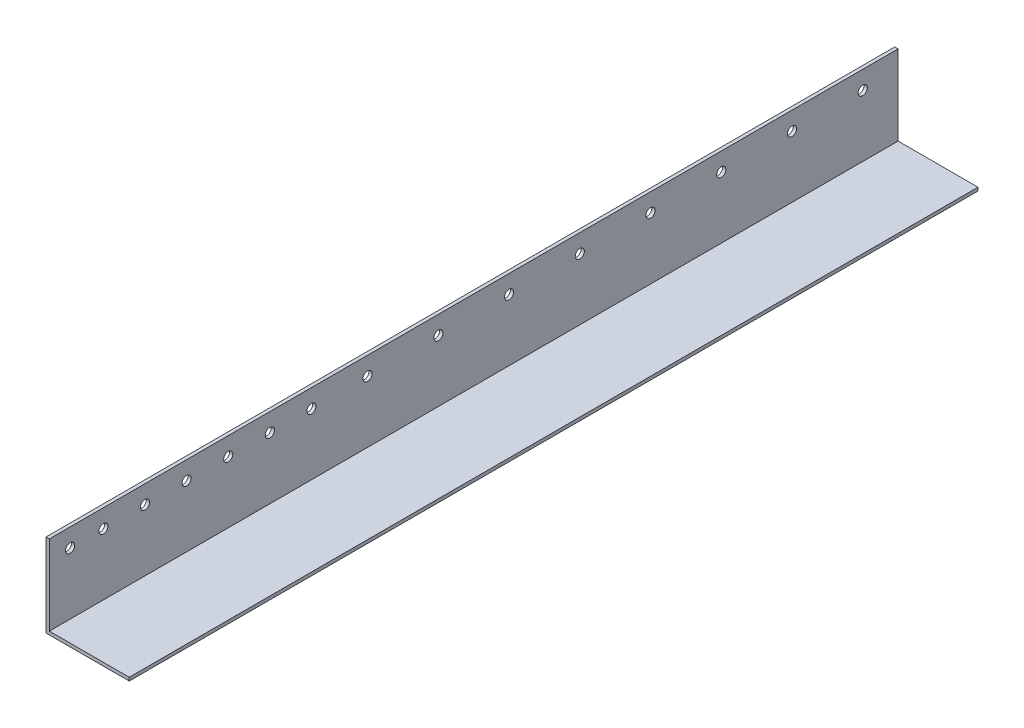
ISO-10303-21;
HEADER;
FILE_DESCRIPTION(('STEP AP214'),'2;1');
FILE_NAME('part.step','',(''),(''),'','','');
FILE_SCHEMA(('AUTOMOTIVE_DESIGN { 1 0 10303 214 1 1 1 1 }'));
ENDSEC;
DATA;
#1=APPLICATION_CONTEXT('core data for automotive mechanical design processes');
#2=APPLICATION_PROTOCOL_DEFINITION('international standard','automotive_design',2000,#1);
#3=PRODUCT_CONTEXT('',#1,'mechanical');
#4=PRODUCT('Part','Part','',(#3));
#5=PRODUCT_RELATED_PRODUCT_CATEGORY('part','',(#4));
#6=PRODUCT_DEFINITION_FORMATION('','',#4);
#7=PRODUCT_DEFINITION_CONTEXT('part definition',#1,'design');
#8=PRODUCT_DEFINITION('design','',#6,#7);
#9=PRODUCT_DEFINITION_SHAPE('','',#8);
#10=(LENGTH_UNIT() NAMED_UNIT(*) SI_UNIT(.MILLI.,.METRE.));
#11=(NAMED_UNIT(*) PLANE_ANGLE_UNIT() SI_UNIT($,.RADIAN.));
#12=(NAMED_UNIT(*) SI_UNIT($,.STERADIAN.) SOLID_ANGLE_UNIT());
#13=UNCERTAINTY_MEASURE_WITH_UNIT(LENGTH_MEASURE(1.E-05),#10,'distance_accuracy_value','');
#14=(GEOMETRIC_REPRESENTATION_CONTEXT(3) GLOBAL_UNCERTAINTY_ASSIGNED_CONTEXT((#13)) GLOBAL_UNIT_ASSIGNED_CONTEXT((#10,
#11,#12)) REPRESENTATION_CONTEXT('',''));
#15=CARTESIAN_POINT('',(0.,0.,0.));
#16=DIRECTION('',(0.,0.,1.));
#17=DIRECTION('',(1.,0.,0.));
#18=AXIS2_PLACEMENT_3D('',#15,#16,#17);
#19=CARTESIAN_POINT('',(0.,50.,510.));
#20=DIRECTION('',(1.,0.,0.));
#21=DIRECTION('',(0.,0.,-1.));
#22=AXIS2_PLACEMENT_3D('',#19,#20,#21);
#23=PLANE('',#22);
#24=CARTESIAN_POINT('',(0.,39.,21.25));
#25=DIRECTION('',(1.,0.,0.));
#26=DIRECTION('',(0.,0.,-1.));
#27=AXIS2_PLACEMENT_3D('',#24,#25,#26);
#28=CIRCLE('',#27,2.75);
#29=CARTESIAN_POINT('',(0.,39.,18.5));
#30=VERTEX_POINT('',#29);
#31=EDGE_CURVE('E127',#30,#30,#28,.T.);
#32=ORIENTED_EDGE('',*,*,#31,.T.);
#33=EDGE_LOOP('',(#32));
#34=FACE_BOUND('',#33,.T.);
#35=CARTESIAN_POINT('',(0.,39.,63.75));
#36=DIRECTION('',(1.,0.,0.));
#37=DIRECTION('',(0.,0.,-1.));
#38=AXIS2_PLACEMENT_3D('',#35,#36,#37);
#39=CIRCLE('',#38,2.75);
#40=CARTESIAN_POINT('',(0.,39.,61.));
#41=VERTEX_POINT('',#40);
#42=EDGE_CURVE('E193',#41,#41,#39,.T.);
#43=ORIENTED_EDGE('',*,*,#42,.T.);
#44=EDGE_LOOP('',(#43));
#45=FACE_BOUND('',#44,.T.);
#46=CARTESIAN_POINT('',(0.,39.,106.25));
#47=DIRECTION('',(1.,0.,0.));
#48=DIRECTION('',(0.,0.,-1.));
#49=AXIS2_PLACEMENT_3D('',#46,#47,#48);
#50=CIRCLE('',#49,2.75);
#51=CARTESIAN_POINT('',(0.,39.,103.5));
#52=VERTEX_POINT('',#51);
#53=EDGE_CURVE('E190',#52,#52,#50,.T.);
#54=ORIENTED_EDGE('',*,*,#53,.T.);
#55=EDGE_LOOP('',(#54));
#56=FACE_BOUND('',#55,.T.);
#57=CARTESIAN_POINT('',(0.,39.,148.75));
#58=DIRECTION('',(1.,0.,0.));
#59=DIRECTION('',(0.,0.,-1.));
#60=AXIS2_PLACEMENT_3D('',#57,#58,#59);
#61=CIRCLE('',#60,2.75);
#62=CARTESIAN_POINT('',(0.,39.,146.));
#63=VERTEX_POINT('',#62);
#64=EDGE_CURVE('E187',#63,#63,#61,.T.);
#65=ORIENTED_EDGE('',*,*,#64,.T.);
#66=EDGE_LOOP('',(#65));
#67=FACE_BOUND('',#66,.T.);
#68=CARTESIAN_POINT('',(0.,39.,191.25));
#69=DIRECTION('',(1.,0.,0.));
#70=DIRECTION('',(0.,0.,-1.));
#71=AXIS2_PLACEMENT_3D('',#68,#69,#70);
#72=CIRCLE('',#71,2.75);
#73=CARTESIAN_POINT('',(0.,39.,188.5));
#74=VERTEX_POINT('',#73);
#75=EDGE_CURVE('E183',#74,#74,#72,.T.);
#76=ORIENTED_EDGE('',*,*,#75,.T.);
#77=EDGE_LOOP('',(#76));
#78=FACE_BOUND('',#77,.T.);
#79=CARTESIAN_POINT('',(0.,39.,233.75));
#80=DIRECTION('',(1.,0.,0.));
#81=DIRECTION('',(0.,0.,-1.));
#82=AXIS2_PLACEMENT_3D('',#79,#80,#81);
#83=CIRCLE('',#82,2.75);
#84=CARTESIAN_POINT('',(0.,39.,231.));
#85=VERTEX_POINT('',#84);
#86=EDGE_CURVE('E179',#85,#85,#83,.T.);
#87=ORIENTED_EDGE('',*,*,#86,.T.);
#88=EDGE_LOOP('',(#87));
#89=FACE_BOUND('',#88,.T.);
#90=CARTESIAN_POINT('',(0.,39.,276.25));
#91=DIRECTION('',(1.,0.,0.));
#92=DIRECTION('',(0.,0.,-1.));
#93=AXIS2_PLACEMENT_3D('',#90,#91,#92);
#94=CIRCLE('',#93,2.74999999999997);
#95=CARTESIAN_POINT('',(0.,39.,273.5));
#96=VERTEX_POINT('',#95);
#97=EDGE_CURVE('E175',#96,#96,#94,.T.);
#98=ORIENTED_EDGE('',*,*,#97,.T.);
#99=EDGE_LOOP('',(#98));
#100=FACE_BOUND('',#99,.T.);
#101=CARTESIAN_POINT('',(0.,39.,318.75));
#102=DIRECTION('',(1.,0.,0.));
#103=DIRECTION('',(0.,0.,-1.));
#104=AXIS2_PLACEMENT_3D('',#101,#102,#103);
#105=CIRCLE('',#104,2.74999999999997);
#106=CARTESIAN_POINT('',(0.,39.,316.));
#107=VERTEX_POINT('',#106);
#108=EDGE_CURVE('E171',#107,#107,#105,.T.);
#109=ORIENTED_EDGE('',*,*,#108,.T.);
#110=EDGE_LOOP('',(#109));
#111=FACE_BOUND('',#110,.T.);
#112=CARTESIAN_POINT('',(0.,39.,352.5));
#113=DIRECTION('',(1.,0.,0.));
#114=DIRECTION('',(0.,0.,-1.));
#115=AXIS2_PLACEMENT_3D('',#112,#113,#114);
#116=CIRCLE('',#115,2.74999999999997);
#117=CARTESIAN_POINT('',(0.,39.,349.75));
#118=VERTEX_POINT('',#117);
#119=EDGE_CURVE('E167',#118,#118,#116,.T.);
#120=ORIENTED_EDGE('',*,*,#119,.T.);
#121=EDGE_LOOP('',(#120));
#122=FACE_BOUND('',#121,.T.);
#123=CARTESIAN_POINT('',(0.,39.,377.5));
#124=DIRECTION('',(1.,0.,0.));
#125=DIRECTION('',(0.,0.,-1.));
#126=AXIS2_PLACEMENT_3D('',#123,#124,#125);
#127=CIRCLE('',#126,2.74999999999997);
#128=CARTESIAN_POINT('',(0.,39.,374.75));
#129=VERTEX_POINT('',#128);
#130=EDGE_CURVE('E163',#129,#129,#127,.T.);
#131=ORIENTED_EDGE('',*,*,#130,.T.);
#132=EDGE_LOOP('',(#131));
#133=FACE_BOUND('',#132,.T.);
#134=CARTESIAN_POINT('',(0.,39.,402.5));
#135=DIRECTION('',(1.,0.,0.));
#136=DIRECTION('',(0.,0.,-1.));
#137=AXIS2_PLACEMENT_3D('',#134,#135,#136);
#138=CIRCLE('',#137,2.74999999999997);
#139=CARTESIAN_POINT('',(0.,39.,399.75));
#140=VERTEX_POINT('',#139);
#141=EDGE_CURVE('E159',#140,#140,#138,.T.);
#142=ORIENTED_EDGE('',*,*,#141,.T.);
#143=EDGE_LOOP('',(#142));
#144=FACE_BOUND('',#143,.T.);
#145=CARTESIAN_POINT('',(0.,39.,427.5));
#146=DIRECTION('',(1.,0.,0.));
#147=DIRECTION('',(0.,0.,-1.));
#148=AXIS2_PLACEMENT_3D('',#145,#146,#147);
#149=CIRCLE('',#148,2.74999999999997);
#150=CARTESIAN_POINT('',(0.,39.,424.75));
#151=VERTEX_POINT('',#150);
#152=EDGE_CURVE('E155',#151,#151,#149,.T.);
#153=ORIENTED_EDGE('',*,*,#152,.T.);
#154=EDGE_LOOP('',(#153));
#155=FACE_BOUND('',#154,.T.);
#156=CARTESIAN_POINT('',(0.,39.,452.5));
#157=DIRECTION('',(1.,0.,0.));
#158=DIRECTION('',(0.,0.,-1.));
#159=AXIS2_PLACEMENT_3D('',#156,#157,#158);
#160=CIRCLE('',#159,2.74999999999997);
#161=CARTESIAN_POINT('',(0.,39.,449.75));
#162=VERTEX_POINT('',#161);
#163=EDGE_CURVE('E151',#162,#162,#160,.T.);
#164=ORIENTED_EDGE('',*,*,#163,.T.);
#165=EDGE_LOOP('',(#164));
#166=FACE_BOUND('',#165,.T.);
#167=CARTESIAN_POINT('',(0.,39.,477.5));
#168=DIRECTION('',(1.,0.,0.));
#169=DIRECTION('',(0.,0.,-1.));
#170=AXIS2_PLACEMENT_3D('',#167,#168,#169);
#171=CIRCLE('',#170,2.74999999999997);
#172=CARTESIAN_POINT('',(0.,39.,474.75));
#173=VERTEX_POINT('',#172);
#174=EDGE_CURVE('E147',#173,#173,#171,.T.);
#175=ORIENTED_EDGE('',*,*,#174,.T.);
#176=EDGE_LOOP('',(#175));
#177=FACE_BOUND('',#176,.T.);
#178=CARTESIAN_POINT('',(0.,39.,497.5));
#179=DIRECTION('',(1.,0.,0.));
#180=DIRECTION('',(0.,0.,-1.));
#181=AXIS2_PLACEMENT_3D('',#178,#179,#180);
#182=CIRCLE('',#181,2.74999999999997);
#183=CARTESIAN_POINT('',(0.,39.,494.75));
#184=VERTEX_POINT('',#183);
#185=EDGE_CURVE('E143',#184,#184,#182,.T.);
#186=ORIENTED_EDGE('',*,*,#185,.T.);
#187=EDGE_LOOP('',(#186));
#188=FACE_BOUND('',#187,.T.);
#189=DIRECTION('',(0.,-1.,0.));
#190=VECTOR('',#189,1.);
#191=CARTESIAN_POINT('',(0.,50.,0.));
#192=LINE('',#191,#190);
#193=CARTESIAN_POINT('',(0.,50.,0.));
#194=VERTEX_POINT('',#193);
#195=CARTESIAN_POINT('',(0.,0.,0.));
#196=VERTEX_POINT('',#195);
#197=EDGE_CURVE('E123',#194,#196,#192,.T.);
#198=ORIENTED_EDGE('',*,*,#197,.T.);
#199=DIRECTION('',(0.,0.,-1.));
#200=VECTOR('',#199,1.);
#201=CARTESIAN_POINT('',(0.,0.,510.));
#202=LINE('',#201,#200);
#203=CARTESIAN_POINT('',(0.,0.,510.));
#204=VERTEX_POINT('',#203);
#205=EDGE_CURVE('E11',#204,#196,#202,.T.);
#206=ORIENTED_EDGE('',*,*,#205,.F.);
#207=DIRECTION('',(0.,-1.,0.));
#208=VECTOR('',#207,1.);
#209=CARTESIAN_POINT('',(0.,50.,510.));
#210=LINE('',#209,#208);
#211=CARTESIAN_POINT('',(0.,50.,510.));
#212=VERTEX_POINT('',#211);
#213=EDGE_CURVE('E134',#212,#204,#210,.T.);
#214=ORIENTED_EDGE('',*,*,#213,.F.);
#215=DIRECTION('',(0.,0.,-1.));
#216=VECTOR('',#215,1.);
#217=CARTESIAN_POINT('',(0.,50.,510.));
#218=LINE('',#217,#216);
#219=EDGE_CURVE('E119',#212,#194,#218,.T.);
#220=ORIENTED_EDGE('',*,*,#219,.T.);
#221=EDGE_LOOP('',(#198,#206,#214,#220));
#222=FACE_BOUND('',#221,.T.);
#223=ADVANCED_FACE('F37',(#34,#45,#56,#67,#78,#89,#100,#111,#122,#133,#144,#155,#166,#177,#188,
#222),#23,.F.);
#224=CARTESIAN_POINT('',(0.,0.,510.));
#225=DIRECTION('',(0.,1.,0.));
#226=DIRECTION('',(0.,0.,1.));
#227=AXIS2_PLACEMENT_3D('',#224,#225,#226);
#228=PLANE('',#227);
#229=DIRECTION('',(1.,0.,0.));
#230=VECTOR('',#229,1.);
#231=CARTESIAN_POINT('',(0.,0.,0.));
#232=LINE('',#231,#230);
#233=CARTESIAN_POINT('',(50.,0.,0.));
#234=VERTEX_POINT('',#233);
#235=EDGE_CURVE('E126',#196,#234,#232,.T.);
#236=ORIENTED_EDGE('',*,*,#235,.T.);
#237=DIRECTION('',(0.,0.,-1.));
#238=VECTOR('',#237,1.);
#239=CARTESIAN_POINT('',(50.,0.,510.));
#240=LINE('',#239,#238);
#241=CARTESIAN_POINT('',(50.,0.,510.));
#242=VERTEX_POINT('',#241);
#243=EDGE_CURVE('E46',#242,#234,#240,.T.);
#244=ORIENTED_EDGE('',*,*,#243,.F.);
#245=DIRECTION('',(1.,0.,0.));
#246=VECTOR('',#245,1.);
#247=CARTESIAN_POINT('',(0.,0.,510.));
#248=LINE('',#247,#246);
#249=EDGE_CURVE('E92',#204,#242,#248,.T.);
#250=ORIENTED_EDGE('',*,*,#249,.F.);
#251=ORIENTED_EDGE('',*,*,#205,.T.);
#252=EDGE_LOOP('',(#236,#244,#250,#251));
#253=FACE_BOUND('',#252,.T.);
#254=ADVANCED_FACE('F210',(#253),#228,.F.);
#255=CARTESIAN_POINT('',(50.,0.,510.));
#256=DIRECTION('',(-1.,0.,0.));
#257=DIRECTION('',(0.,0.,1.));
#258=AXIS2_PLACEMENT_3D('',#255,#256,#257);
#259=PLANE('',#258);
#260=DIRECTION('',(0.,1.,0.));
#261=VECTOR('',#260,1.);
#262=CARTESIAN_POINT('',(50.,0.,0.));
#263=LINE('',#262,#261);
#264=CARTESIAN_POINT('',(50.,2.,0.));
#265=VERTEX_POINT('',#264);
#266=EDGE_CURVE('E129',#234,#265,#263,.T.);
#267=ORIENTED_EDGE('',*,*,#266,.T.);
#268=DIRECTION('',(0.,0.,-1.));
#269=VECTOR('',#268,1.);
#270=CARTESIAN_POINT('',(50.,2.,510.));
#271=LINE('',#270,#269);
#272=CARTESIAN_POINT('',(50.,2.,510.));
#273=VERTEX_POINT('',#272);
#274=EDGE_CURVE('E114',#273,#265,#271,.T.);
#275=ORIENTED_EDGE('',*,*,#274,.F.);
#276=DIRECTION('',(0.,1.,0.));
#277=VECTOR('',#276,1.);
#278=CARTESIAN_POINT('',(50.,0.,510.));
#279=LINE('',#278,#277);
#280=EDGE_CURVE('E105',#242,#273,#279,.T.);
#281=ORIENTED_EDGE('',*,*,#280,.F.);
#282=ORIENTED_EDGE('',*,*,#243,.T.);
#283=EDGE_LOOP('',(#267,#275,#281,#282));
#284=FACE_BOUND('',#283,.T.);
#285=ADVANCED_FACE('F213',(#284),#259,.F.);
#286=CARTESIAN_POINT('',(50.,2.,510.));
#287=DIRECTION('',(0.,-1.,0.));
#288=DIRECTION('',(0.,0.,-1.));
#289=AXIS2_PLACEMENT_3D('',#286,#287,#288);
#290=PLANE('',#289);
#291=DIRECTION('',(-1.,0.,0.));
#292=VECTOR('',#291,1.);
#293=CARTESIAN_POINT('',(50.,2.,0.));
#294=LINE('',#293,#292);
#295=CARTESIAN_POINT('',(2.,2.,0.));
#296=VERTEX_POINT('',#295);
#297=EDGE_CURVE('E113',#265,#296,#294,.T.);
#298=ORIENTED_EDGE('',*,*,#297,.T.);
#299=DIRECTION('',(0.,0.,-1.));
#300=VECTOR('',#299,1.);
#301=CARTESIAN_POINT('',(2.,2.,510.));
#302=LINE('',#301,#300);
#303=CARTESIAN_POINT('',(2.,2.,510.));
#304=VERTEX_POINT('',#303);
#305=EDGE_CURVE('E110',#304,#296,#302,.T.);
#306=ORIENTED_EDGE('',*,*,#305,.F.);
#307=DIRECTION('',(-1.,0.,0.));
#308=VECTOR('',#307,1.);
#309=CARTESIAN_POINT('',(50.,2.,510.));
#310=LINE('',#309,#308);
#311=EDGE_CURVE('E99',#273,#304,#310,.T.);
#312=ORIENTED_EDGE('',*,*,#311,.F.);
#313=ORIENTED_EDGE('',*,*,#274,.T.);
#314=EDGE_LOOP('',(#298,#306,#312,#313));
#315=FACE_BOUND('',#314,.T.);
#316=ADVANCED_FACE('F111',(#315),#290,.F.);
#317=CARTESIAN_POINT('',(2.,2.,510.));
#318=DIRECTION('',(-1.,0.,0.));
#319=DIRECTION('',(0.,0.,1.));
#320=AXIS2_PLACEMENT_3D('',#317,#318,#319);
#321=PLANE('',#320);
#322=CARTESIAN_POINT('',(2.,39.,21.25));
#323=DIRECTION('',(-1.,0.,0.));
#324=DIRECTION('',(0.,0.,1.));
#325=AXIS2_PLACEMENT_3D('',#322,#323,#324);
#326=CIRCLE('',#325,2.75);
#327=CARTESIAN_POINT('',(2.,39.,24.));
#328=VERTEX_POINT('',#327);
#329=EDGE_CURVE('E40',#328,#328,#326,.T.);
#330=ORIENTED_EDGE('',*,*,#329,.T.);
#331=EDGE_LOOP('',(#330));
#332=FACE_BOUND('',#331,.T.);
#333=CARTESIAN_POINT('',(2.,39.,63.75));
#334=DIRECTION('',(-1.,0.,0.));
#335=DIRECTION('',(0.,0.,1.));
#336=AXIS2_PLACEMENT_3D('',#333,#334,#335);
#337=CIRCLE('',#336,2.75);
#338=CARTESIAN_POINT('',(2.,39.,66.5));
#339=VERTEX_POINT('',#338);
#340=EDGE_CURVE('E191',#339,#339,#337,.T.);
#341=ORIENTED_EDGE('',*,*,#340,.T.);
#342=EDGE_LOOP('',(#341));
#343=FACE_BOUND('',#342,.T.);
#344=CARTESIAN_POINT('',(2.,39.,106.25));
#345=DIRECTION('',(-1.,0.,0.));
#346=DIRECTION('',(0.,0.,1.));
#347=AXIS2_PLACEMENT_3D('',#344,#345,#346);
#348=CIRCLE('',#347,2.75);
#349=CARTESIAN_POINT('',(2.,39.,109.));
#350=VERTEX_POINT('',#349);
#351=EDGE_CURVE('E188',#350,#350,#348,.T.);
#352=ORIENTED_EDGE('',*,*,#351,.T.);
#353=EDGE_LOOP('',(#352));
#354=FACE_BOUND('',#353,.T.);
#355=CARTESIAN_POINT('',(2.,39.,148.75));
#356=DIRECTION('',(-1.,0.,0.));
#357=DIRECTION('',(0.,0.,1.));
#358=AXIS2_PLACEMENT_3D('',#355,#356,#357);
#359=CIRCLE('',#358,2.75);
#360=CARTESIAN_POINT('',(2.,39.,151.5));
#361=VERTEX_POINT('',#360);
#362=EDGE_CURVE('E184',#361,#361,#359,.T.);
#363=ORIENTED_EDGE('',*,*,#362,.T.);
#364=EDGE_LOOP('',(#363));
#365=FACE_BOUND('',#364,.T.);
#366=CARTESIAN_POINT('',(2.,39.,191.25));
#367=DIRECTION('',(-1.,0.,0.));
#368=DIRECTION('',(0.,0.,1.));
#369=AXIS2_PLACEMENT_3D('',#366,#367,#368);
#370=CIRCLE('',#369,2.75);
#371=CARTESIAN_POINT('',(2.,39.,194.));
#372=VERTEX_POINT('',#371);
#373=EDGE_CURVE('E180',#372,#372,#370,.T.);
#374=ORIENTED_EDGE('',*,*,#373,.T.);
#375=EDGE_LOOP('',(#374));
#376=FACE_BOUND('',#375,.T.);
#377=CARTESIAN_POINT('',(2.,39.,233.75));
#378=DIRECTION('',(-1.,0.,0.));
#379=DIRECTION('',(0.,0.,1.));
#380=AXIS2_PLACEMENT_3D('',#377,#378,#379);
#381=CIRCLE('',#380,2.75);
#382=CARTESIAN_POINT('',(2.,39.,236.5));
#383=VERTEX_POINT('',#382);
#384=EDGE_CURVE('E176',#383,#383,#381,.T.);
#385=ORIENTED_EDGE('',*,*,#384,.T.);
#386=EDGE_LOOP('',(#385));
#387=FACE_BOUND('',#386,.T.);
#388=CARTESIAN_POINT('',(2.,39.,276.25));
#389=DIRECTION('',(-1.,0.,0.));
#390=DIRECTION('',(0.,0.,1.));
#391=AXIS2_PLACEMENT_3D('',#388,#389,#390);
#392=CIRCLE('',#391,2.74999999999997);
#393=CARTESIAN_POINT('',(2.,39.,279.));
#394=VERTEX_POINT('',#393);
#395=EDGE_CURVE('E172',#394,#394,#392,.T.);
#396=ORIENTED_EDGE('',*,*,#395,.T.);
#397=EDGE_LOOP('',(#396));
#398=FACE_BOUND('',#397,.T.);
#399=CARTESIAN_POINT('',(2.,39.,318.75));
#400=DIRECTION('',(-1.,0.,0.));
#401=DIRECTION('',(0.,0.,1.));
#402=AXIS2_PLACEMENT_3D('',#399,#400,#401);
#403=CIRCLE('',#402,2.74999999999997);
#404=CARTESIAN_POINT('',(2.,39.,321.5));
#405=VERTEX_POINT('',#404);
#406=EDGE_CURVE('E168',#405,#405,#403,.T.);
#407=ORIENTED_EDGE('',*,*,#406,.T.);
#408=EDGE_LOOP('',(#407));
#409=FACE_BOUND('',#408,.T.);
#410=CARTESIAN_POINT('',(2.,39.,352.5));
#411=DIRECTION('',(-1.,0.,0.));
#412=DIRECTION('',(0.,0.,1.));
#413=AXIS2_PLACEMENT_3D('',#410,#411,#412);
#414=CIRCLE('',#413,2.74999999999997);
#415=CARTESIAN_POINT('',(2.,39.,355.25));
#416=VERTEX_POINT('',#415);
#417=EDGE_CURVE('E164',#416,#416,#414,.T.);
#418=ORIENTED_EDGE('',*,*,#417,.T.);
#419=EDGE_LOOP('',(#418));
#420=FACE_BOUND('',#419,.T.);
#421=CARTESIAN_POINT('',(2.,39.,377.5));
#422=DIRECTION('',(-1.,0.,0.));
#423=DIRECTION('',(0.,0.,1.));
#424=AXIS2_PLACEMENT_3D('',#421,#422,#423);
#425=CIRCLE('',#424,2.74999999999997);
#426=CARTESIAN_POINT('',(2.,39.,380.25));
#427=VERTEX_POINT('',#426);
#428=EDGE_CURVE('E160',#427,#427,#425,.T.);
#429=ORIENTED_EDGE('',*,*,#428,.T.);
#430=EDGE_LOOP('',(#429));
#431=FACE_BOUND('',#430,.T.);
#432=CARTESIAN_POINT('',(2.,39.,402.5));
#433=DIRECTION('',(-1.,0.,0.));
#434=DIRECTION('',(0.,0.,1.));
#435=AXIS2_PLACEMENT_3D('',#432,#433,#434);
#436=CIRCLE('',#435,2.74999999999997);
#437=CARTESIAN_POINT('',(2.,39.,405.25));
#438=VERTEX_POINT('',#437);
#439=EDGE_CURVE('E156',#438,#438,#436,.T.);
#440=ORIENTED_EDGE('',*,*,#439,.T.);
#441=EDGE_LOOP('',(#440));
#442=FACE_BOUND('',#441,.T.);
#443=CARTESIAN_POINT('',(2.,39.,427.5));
#444=DIRECTION('',(-1.,0.,0.));
#445=DIRECTION('',(0.,0.,1.));
#446=AXIS2_PLACEMENT_3D('',#443,#444,#445);
#447=CIRCLE('',#446,2.74999999999997);
#448=CARTESIAN_POINT('',(2.,39.,430.25));
#449=VERTEX_POINT('',#448);
#450=EDGE_CURVE('E152',#449,#449,#447,.T.);
#451=ORIENTED_EDGE('',*,*,#450,.T.);
#452=EDGE_LOOP('',(#451));
#453=FACE_BOUND('',#452,.T.);
#454=CARTESIAN_POINT('',(2.,39.,452.5));
#455=DIRECTION('',(-1.,0.,0.));
#456=DIRECTION('',(0.,0.,1.));
#457=AXIS2_PLACEMENT_3D('',#454,#455,#456);
#458=CIRCLE('',#457,2.74999999999997);
#459=CARTESIAN_POINT('',(2.,39.,455.25));
#460=VERTEX_POINT('',#459);
#461=EDGE_CURVE('E148',#460,#460,#458,.T.);
#462=ORIENTED_EDGE('',*,*,#461,.T.);
#463=EDGE_LOOP('',(#462));
#464=FACE_BOUND('',#463,.T.);
#465=CARTESIAN_POINT('',(2.,39.,477.5));
#466=DIRECTION('',(-1.,0.,0.));
#467=DIRECTION('',(0.,0.,1.));
#468=AXIS2_PLACEMENT_3D('',#465,#466,#467);
#469=CIRCLE('',#468,2.74999999999997);
#470=CARTESIAN_POINT('',(2.,39.,480.25));
#471=VERTEX_POINT('',#470);
#472=EDGE_CURVE('E144',#471,#471,#469,.T.);
#473=ORIENTED_EDGE('',*,*,#472,.T.);
#474=EDGE_LOOP('',(#473));
#475=FACE_BOUND('',#474,.T.);
#476=CARTESIAN_POINT('',(2.,39.,497.5));
#477=DIRECTION('',(-1.,0.,0.));
#478=DIRECTION('',(0.,0.,1.));
#479=AXIS2_PLACEMENT_3D('',#476,#477,#478);
#480=CIRCLE('',#479,2.74999999999997);
#481=CARTESIAN_POINT('',(2.,39.,500.25));
#482=VERTEX_POINT('',#481);
#483=EDGE_CURVE('E140',#482,#482,#480,.T.);
#484=ORIENTED_EDGE('',*,*,#483,.T.);
#485=EDGE_LOOP('',(#484));
#486=FACE_BOUND('',#485,.T.);
#487=DIRECTION('',(0.,1.,0.));
#488=VECTOR('',#487,1.);
#489=CARTESIAN_POINT('',(2.,2.,0.));
#490=LINE('',#489,#488);
#491=CARTESIAN_POINT('',(2.,50.,0.));
#492=VERTEX_POINT('',#491);
#493=EDGE_CURVE('E78',#296,#492,#490,.T.);
#494=ORIENTED_EDGE('',*,*,#493,.T.);
#495=DIRECTION('',(0.,0.,-1.));
#496=VECTOR('',#495,1.);
#497=CARTESIAN_POINT('',(2.,50.,510.));
#498=LINE('',#497,#496);
#499=CARTESIAN_POINT('',(2.,50.,510.));
#500=VERTEX_POINT('',#499);
#501=EDGE_CURVE('E115',#500,#492,#498,.T.);
#502=ORIENTED_EDGE('',*,*,#501,.F.);
#503=DIRECTION('',(0.,1.,0.));
#504=VECTOR('',#503,1.);
#505=CARTESIAN_POINT('',(2.,2.,510.));
#506=LINE('',#505,#504);
#507=EDGE_CURVE('E103',#304,#500,#506,.T.);
#508=ORIENTED_EDGE('',*,*,#507,.F.);
#509=ORIENTED_EDGE('',*,*,#305,.T.);
#510=EDGE_LOOP('',(#494,#502,#508,#509));
#511=FACE_BOUND('',#510,.T.);
#512=ADVANCED_FACE('F117',(#332,#343,#354,#365,#376,#387,#398,#409,#420,#431,#442,#453,#464,
#475,#486,#511),#321,.F.);
#513=CARTESIAN_POINT('',(2.,50.,510.));
#514=DIRECTION('',(0.,-1.,0.));
#515=DIRECTION('',(0.,0.,-1.));
#516=AXIS2_PLACEMENT_3D('',#513,#514,#515);
#517=PLANE('',#516);
#518=DIRECTION('',(-1.,0.,0.));
#519=VECTOR('',#518,1.);
#520=CARTESIAN_POINT('',(2.,50.,0.));
#521=LINE('',#520,#519);
#522=EDGE_CURVE('E84',#492,#194,#521,.T.);
#523=ORIENTED_EDGE('',*,*,#522,.T.);
#524=ORIENTED_EDGE('',*,*,#219,.F.);
#525=DIRECTION('',(-1.,0.,0.));
#526=VECTOR('',#525,1.);
#527=CARTESIAN_POINT('',(2.,50.,510.));
#528=LINE('',#527,#526);
#529=EDGE_CURVE('E55',#500,#212,#528,.T.);
#530=ORIENTED_EDGE('',*,*,#529,.F.);
#531=ORIENTED_EDGE('',*,*,#501,.T.);
#532=EDGE_LOOP('',(#523,#524,#530,#531));
#533=FACE_BOUND('',#532,.T.);
#534=ADVANCED_FACE('F218',(#533),#517,.F.);
#535=CARTESIAN_POINT('',(0.,0.,510.));
#536=DIRECTION('',(0.,0.,1.));
#537=DIRECTION('',(1.,0.,0.));
#538=AXIS2_PLACEMENT_3D('',#535,#536,#537);
#539=PLANE('',#538);
#540=ORIENTED_EDGE('',*,*,#213,.T.);
#541=ORIENTED_EDGE('',*,*,#249,.T.);
#542=ORIENTED_EDGE('',*,*,#280,.T.);
#543=ORIENTED_EDGE('',*,*,#311,.T.);
#544=ORIENTED_EDGE('',*,*,#507,.T.);
#545=ORIENTED_EDGE('',*,*,#529,.T.);
#546=EDGE_LOOP('',(#540,#541,#542,#543,#544,#545));
#547=FACE_BOUND('',#546,.T.);
#548=ADVANCED_FACE('F101',(#547),#539,.T.);
#549=CARTESIAN_POINT('',(0.,0.,0.));
#550=DIRECTION('',(0.,0.,1.));
#551=DIRECTION('',(1.,0.,0.));
#552=AXIS2_PLACEMENT_3D('',#549,#550,#551);
#553=PLANE('',#552);
#554=ORIENTED_EDGE('',*,*,#197,.F.);
#555=ORIENTED_EDGE('',*,*,#522,.F.);
#556=ORIENTED_EDGE('',*,*,#493,.F.);
#557=ORIENTED_EDGE('',*,*,#297,.F.);
#558=ORIENTED_EDGE('',*,*,#266,.F.);
#559=ORIENTED_EDGE('',*,*,#235,.F.);
#560=EDGE_LOOP('',(#554,#555,#556,#557,#558,#559));
#561=FACE_BOUND('',#560,.T.);
#562=ADVANCED_FACE('F216',(#561),#553,.F.);
#563=CARTESIAN_POINT('',(-5.,39.,497.5));
#564=DIRECTION('',(1.,0.,0.));
#565=DIRECTION('',(0.,0.,-1.));
#566=AXIS2_PLACEMENT_3D('',#563,#564,#565);
#567=CYLINDRICAL_SURFACE('',#566,2.74999999999997);
#568=ORIENTED_EDGE('',*,*,#483,.F.);
#569=EDGE_LOOP('',(#568));
#570=FACE_BOUND('',#569,.T.);
#571=ORIENTED_EDGE('',*,*,#185,.F.);
#572=EDGE_LOOP('',(#571));
#573=FACE_BOUND('',#572,.T.);
#574=ADVANCED_FACE('F284',(#570,#573),#567,.F.);
#575=CARTESIAN_POINT('',(-5.,39.,477.5));
#576=DIRECTION('',(1.,0.,0.));
#577=DIRECTION('',(0.,0.,-1.));
#578=AXIS2_PLACEMENT_3D('',#575,#576,#577);
#579=CYLINDRICAL_SURFACE('',#578,2.74999999999997);
#580=ORIENTED_EDGE('',*,*,#472,.F.);
#581=EDGE_LOOP('',(#580));
#582=FACE_BOUND('',#581,.T.);
#583=ORIENTED_EDGE('',*,*,#174,.F.);
#584=EDGE_LOOP('',(#583));
#585=FACE_BOUND('',#584,.T.);
#586=ADVANCED_FACE('F286',(#582,#585),#579,.F.);
#587=CARTESIAN_POINT('',(-5.,39.,452.5));
#588=DIRECTION('',(1.,0.,0.));
#589=DIRECTION('',(0.,0.,-1.));
#590=AXIS2_PLACEMENT_3D('',#587,#588,#589);
#591=CYLINDRICAL_SURFACE('',#590,2.74999999999997);
#592=ORIENTED_EDGE('',*,*,#461,.F.);
#593=EDGE_LOOP('',(#592));
#594=FACE_BOUND('',#593,.T.);
#595=ORIENTED_EDGE('',*,*,#163,.F.);
#596=EDGE_LOOP('',(#595));
#597=FACE_BOUND('',#596,.T.);
#598=ADVANCED_FACE('F293',(#594,#597),#591,.F.);
#599=CARTESIAN_POINT('',(-5.,39.,427.5));
#600=DIRECTION('',(1.,0.,0.));
#601=DIRECTION('',(0.,0.,-1.));
#602=AXIS2_PLACEMENT_3D('',#599,#600,#601);
#603=CYLINDRICAL_SURFACE('',#602,2.74999999999997);
#604=ORIENTED_EDGE('',*,*,#450,.F.);
#605=EDGE_LOOP('',(#604));
#606=FACE_BOUND('',#605,.T.);
#607=ORIENTED_EDGE('',*,*,#152,.F.);
#608=EDGE_LOOP('',(#607));
#609=FACE_BOUND('',#608,.T.);
#610=ADVANCED_FACE('F300',(#606,#609),#603,.F.);
#611=CARTESIAN_POINT('',(-5.,39.,402.5));
#612=DIRECTION('',(1.,0.,0.));
#613=DIRECTION('',(0.,0.,-1.));
#614=AXIS2_PLACEMENT_3D('',#611,#612,#613);
#615=CYLINDRICAL_SURFACE('',#614,2.74999999999997);
#616=ORIENTED_EDGE('',*,*,#439,.F.);
#617=EDGE_LOOP('',(#616));
#618=FACE_BOUND('',#617,.T.);
#619=ORIENTED_EDGE('',*,*,#141,.F.);
#620=EDGE_LOOP('',(#619));
#621=FACE_BOUND('',#620,.T.);
#622=ADVANCED_FACE('F304',(#618,#621),#615,.F.);
#623=CARTESIAN_POINT('',(-5.,39.,377.5));
#624=DIRECTION('',(1.,0.,0.));
#625=DIRECTION('',(0.,0.,-1.));
#626=AXIS2_PLACEMENT_3D('',#623,#624,#625);
#627=CYLINDRICAL_SURFACE('',#626,2.74999999999997);
#628=ORIENTED_EDGE('',*,*,#428,.F.);
#629=EDGE_LOOP('',(#628));
#630=FACE_BOUND('',#629,.T.);
#631=ORIENTED_EDGE('',*,*,#130,.F.);
#632=EDGE_LOOP('',(#631));
#633=FACE_BOUND('',#632,.T.);
#634=ADVANCED_FACE('F308',(#630,#633),#627,.F.);
#635=CARTESIAN_POINT('',(-5.,39.,352.5));
#636=DIRECTION('',(1.,0.,0.));
#637=DIRECTION('',(0.,0.,-1.));
#638=AXIS2_PLACEMENT_3D('',#635,#636,#637);
#639=CYLINDRICAL_SURFACE('',#638,2.74999999999997);
#640=ORIENTED_EDGE('',*,*,#417,.F.);
#641=EDGE_LOOP('',(#640));
#642=FACE_BOUND('',#641,.T.);
#643=ORIENTED_EDGE('',*,*,#119,.F.);
#644=EDGE_LOOP('',(#643));
#645=FACE_BOUND('',#644,.T.);
#646=ADVANCED_FACE('F312',(#642,#645),#639,.F.);
#647=CARTESIAN_POINT('',(-5.,39.,318.75));
#648=DIRECTION('',(1.,0.,0.));
#649=DIRECTION('',(0.,0.,-1.));
#650=AXIS2_PLACEMENT_3D('',#647,#648,#649);
#651=CYLINDRICAL_SURFACE('',#650,2.74999999999997);
#652=ORIENTED_EDGE('',*,*,#406,.F.);
#653=EDGE_LOOP('',(#652));
#654=FACE_BOUND('',#653,.T.);
#655=ORIENTED_EDGE('',*,*,#108,.F.);
#656=EDGE_LOOP('',(#655));
#657=FACE_BOUND('',#656,.T.);
#658=ADVANCED_FACE('F316',(#654,#657),#651,.F.);
#659=CARTESIAN_POINT('',(-5.,39.,276.25));
#660=DIRECTION('',(1.,0.,0.));
#661=DIRECTION('',(0.,0.,-1.));
#662=AXIS2_PLACEMENT_3D('',#659,#660,#661);
#663=CYLINDRICAL_SURFACE('',#662,2.74999999999997);
#664=ORIENTED_EDGE('',*,*,#395,.F.);
#665=EDGE_LOOP('',(#664));
#666=FACE_BOUND('',#665,.T.);
#667=ORIENTED_EDGE('',*,*,#97,.F.);
#668=EDGE_LOOP('',(#667));
#669=FACE_BOUND('',#668,.T.);
#670=ADVANCED_FACE('F320',(#666,#669),#663,.F.);
#671=CARTESIAN_POINT('',(-5.,39.,233.75));
#672=DIRECTION('',(1.,0.,0.));
#673=DIRECTION('',(0.,0.,-1.));
#674=AXIS2_PLACEMENT_3D('',#671,#672,#673);
#675=CYLINDRICAL_SURFACE('',#674,2.75);
#676=ORIENTED_EDGE('',*,*,#384,.F.);
#677=EDGE_LOOP('',(#676));
#678=FACE_BOUND('',#677,.T.);
#679=ORIENTED_EDGE('',*,*,#86,.F.);
#680=EDGE_LOOP('',(#679));
#681=FACE_BOUND('',#680,.T.);
#682=ADVANCED_FACE('F324',(#678,#681),#675,.F.);
#683=CARTESIAN_POINT('',(-5.,39.,191.25));
#684=DIRECTION('',(1.,0.,0.));
#685=DIRECTION('',(0.,0.,-1.));
#686=AXIS2_PLACEMENT_3D('',#683,#684,#685);
#687=CYLINDRICAL_SURFACE('',#686,2.75);
#688=ORIENTED_EDGE('',*,*,#373,.F.);
#689=EDGE_LOOP('',(#688));
#690=FACE_BOUND('',#689,.T.);
#691=ORIENTED_EDGE('',*,*,#75,.F.);
#692=EDGE_LOOP('',(#691));
#693=FACE_BOUND('',#692,.T.);
#694=ADVANCED_FACE('F328',(#690,#693),#687,.F.);
#695=CARTESIAN_POINT('',(-5.,39.,148.75));
#696=DIRECTION('',(1.,0.,0.));
#697=DIRECTION('',(0.,0.,-1.));
#698=AXIS2_PLACEMENT_3D('',#695,#696,#697);
#699=CYLINDRICAL_SURFACE('',#698,2.75);
#700=ORIENTED_EDGE('',*,*,#362,.F.);
#701=EDGE_LOOP('',(#700));
#702=FACE_BOUND('',#701,.T.);
#703=ORIENTED_EDGE('',*,*,#64,.F.);
#704=EDGE_LOOP('',(#703));
#705=FACE_BOUND('',#704,.T.);
#706=ADVANCED_FACE('F332',(#702,#705),#699,.F.);
#707=CARTESIAN_POINT('',(-5.,39.,106.25));
#708=DIRECTION('',(1.,0.,0.));
#709=DIRECTION('',(0.,0.,-1.));
#710=AXIS2_PLACEMENT_3D('',#707,#708,#709);
#711=CYLINDRICAL_SURFACE('',#710,2.75);
#712=ORIENTED_EDGE('',*,*,#351,.F.);
#713=EDGE_LOOP('',(#712));
#714=FACE_BOUND('',#713,.T.);
#715=ORIENTED_EDGE('',*,*,#53,.F.);
#716=EDGE_LOOP('',(#715));
#717=FACE_BOUND('',#716,.T.);
#718=ADVANCED_FACE('F336',(#714,#717),#711,.F.);
#719=CARTESIAN_POINT('',(-5.,39.,63.75));
#720=DIRECTION('',(1.,0.,0.));
#721=DIRECTION('',(0.,0.,-1.));
#722=AXIS2_PLACEMENT_3D('',#719,#720,#721);
#723=CYLINDRICAL_SURFACE('',#722,2.75);
#724=ORIENTED_EDGE('',*,*,#340,.F.);
#725=EDGE_LOOP('',(#724));
#726=FACE_BOUND('',#725,.T.);
#727=ORIENTED_EDGE('',*,*,#42,.F.);
#728=EDGE_LOOP('',(#727));
#729=FACE_BOUND('',#728,.T.);
#730=ADVANCED_FACE('F340',(#726,#729),#723,.F.);
#731=CARTESIAN_POINT('',(-5.,39.,21.25));
#732=DIRECTION('',(1.,0.,0.));
#733=DIRECTION('',(0.,0.,-1.));
#734=AXIS2_PLACEMENT_3D('',#731,#732,#733);
#735=CYLINDRICAL_SURFACE('',#734,2.75);
#736=ORIENTED_EDGE('',*,*,#329,.F.);
#737=EDGE_LOOP('',(#736));
#738=FACE_BOUND('',#737,.T.);
#739=ORIENTED_EDGE('',*,*,#31,.F.);
#740=EDGE_LOOP('',(#739));
#741=FACE_BOUND('',#740,.T.);
#742=ADVANCED_FACE('F344',(#738,#741),#735,.F.);
#743=CLOSED_SHELL('',(#223,#254,#285,#316,#512,#534,#548,#562,#574,#586,#598,#610,#622,#634,
#646,#658,#670,#682,#694,#706,#718,#730,#742));
#744=MANIFOLD_SOLID_BREP('B2',#743);
#745=ADVANCED_BREP_SHAPE_REPRESENTATION('',(#18,#744),#14);
#746=SHAPE_DEFINITION_REPRESENTATION(#9,#745);
ENDSEC;
END-ISO-10303-21;
